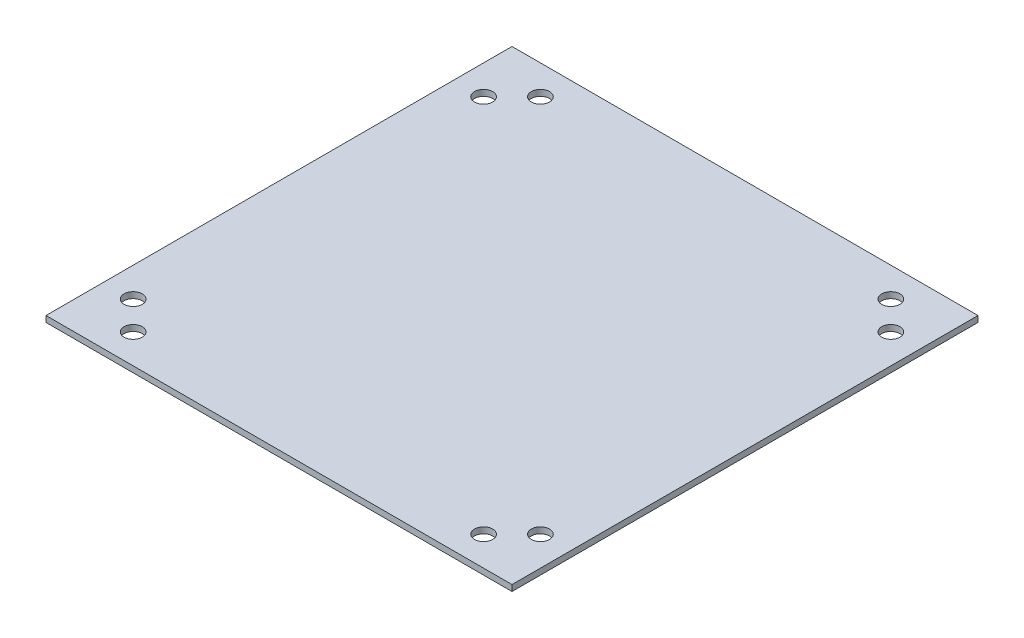
ISO-10303-21;
HEADER;
FILE_DESCRIPTION(('STEP AP214'),'2;1');
FILE_NAME('part.step','',(''),(''),'','','');
FILE_SCHEMA(('AUTOMOTIVE_DESIGN { 1 0 10303 214 1 1 1 1 }'));
ENDSEC;
DATA;
#1=APPLICATION_CONTEXT('core data for automotive mechanical design processes');
#2=APPLICATION_PROTOCOL_DEFINITION('international standard','automotive_design',2000,#1);
#3=PRODUCT_CONTEXT('',#1,'mechanical');
#4=PRODUCT('Part','Part','',(#3));
#5=PRODUCT_RELATED_PRODUCT_CATEGORY('part','',(#4));
#6=PRODUCT_DEFINITION_FORMATION('','',#4);
#7=PRODUCT_DEFINITION_CONTEXT('part definition',#1,'design');
#8=PRODUCT_DEFINITION('design','',#6,#7);
#9=PRODUCT_DEFINITION_SHAPE('','',#8);
#10=(LENGTH_UNIT() NAMED_UNIT(*) SI_UNIT(.MILLI.,.METRE.));
#11=(NAMED_UNIT(*) PLANE_ANGLE_UNIT() SI_UNIT($,.RADIAN.));
#12=(NAMED_UNIT(*) SI_UNIT($,.STERADIAN.) SOLID_ANGLE_UNIT());
#13=UNCERTAINTY_MEASURE_WITH_UNIT(LENGTH_MEASURE(1.E-05),#10,'distance_accuracy_value','');
#14=(GEOMETRIC_REPRESENTATION_CONTEXT(3) GLOBAL_UNCERTAINTY_ASSIGNED_CONTEXT((#13)) GLOBAL_UNIT_ASSIGNED_CONTEXT((#10,
#11,#12)) REPRESENTATION_CONTEXT('',''));
#15=CARTESIAN_POINT('',(0.,0.,0.));
#16=DIRECTION('',(0.,0.,1.));
#17=DIRECTION('',(1.,0.,0.));
#18=AXIS2_PLACEMENT_3D('',#15,#16,#17);
#19=CARTESIAN_POINT('',(-1.3,0.,-98.7));
#20=DIRECTION('',(-1.,0.,0.));
#21=DIRECTION('',(0.,0.,1.));
#22=AXIS2_PLACEMENT_3D('',#19,#20,#21);
#23=PLANE('',#22);
#24=DIRECTION('',(0.,0.,1.));
#25=VECTOR('',#24,1.);
#26=CARTESIAN_POINT('',(-1.3,1.3,-98.7));
#27=LINE('',#26,#25);
#28=CARTESIAN_POINT('',(-1.3,1.3,-98.7));
#29=VERTEX_POINT('',#28);
#30=CARTESIAN_POINT('',(-1.29999999999999,1.3,1.3));
#31=VERTEX_POINT('',#30);
#32=EDGE_CURVE('E101',#29,#31,#27,.T.);
#33=ORIENTED_EDGE('',*,*,#32,.F.);
#34=DIRECTION('',(0.,1.,0.));
#35=VECTOR('',#34,1.);
#36=CARTESIAN_POINT('',(-1.3,0.,-98.7));
#37=LINE('',#36,#35);
#38=CARTESIAN_POINT('',(-1.3,0.,-98.7));
#39=VERTEX_POINT('',#38);
#40=EDGE_CURVE('E11',#39,#29,#37,.T.);
#41=ORIENTED_EDGE('',*,*,#40,.F.);
#42=DIRECTION('',(0.,0.,1.));
#43=VECTOR('',#42,1.);
#44=CARTESIAN_POINT('',(-1.3,0.,-98.7));
#45=LINE('',#44,#43);
#46=CARTESIAN_POINT('',(-1.29999999999999,0.,1.3));
#47=VERTEX_POINT('',#46);
#48=EDGE_CURVE('E95',#39,#47,#45,.T.);
#49=ORIENTED_EDGE('',*,*,#48,.T.);
#50=DIRECTION('',(0.,1.,0.));
#51=VECTOR('',#50,1.);
#52=CARTESIAN_POINT('',(-1.29999999999999,0.,1.3));
#53=LINE('',#52,#51);
#54=EDGE_CURVE('E39',#47,#31,#53,.T.);
#55=ORIENTED_EDGE('',*,*,#54,.T.);
#56=EDGE_LOOP('',(#33,#41,#49,#55));
#57=FACE_BOUND('',#56,.T.);
#58=ADVANCED_FACE('F35',(#57),#23,.T.);
#59=CARTESIAN_POINT('',(-1.3,0.,-98.7));
#60=DIRECTION('',(0.,0.,1.));
#61=DIRECTION('',(1.,0.,0.));
#62=AXIS2_PLACEMENT_3D('',#59,#60,#61);
#63=PLANE('',#62);
#64=DIRECTION('',(1.,0.,0.));
#65=VECTOR('',#64,1.);
#66=CARTESIAN_POINT('',(-1.3,1.3,-98.7));
#67=LINE('',#66,#65);
#68=CARTESIAN_POINT('',(98.7,1.3,-98.7));
#69=VERTEX_POINT('',#68);
#70=EDGE_CURVE('E69',#29,#69,#67,.T.);
#71=ORIENTED_EDGE('',*,*,#70,.T.);
#72=DIRECTION('',(0.,1.,0.));
#73=VECTOR('',#72,1.);
#74=CARTESIAN_POINT('',(98.7,0.,-98.7));
#75=LINE('',#74,#73);
#76=CARTESIAN_POINT('',(98.7,0.,-98.7));
#77=VERTEX_POINT('',#76);
#78=EDGE_CURVE('E45',#77,#69,#75,.T.);
#79=ORIENTED_EDGE('',*,*,#78,.F.);
#80=DIRECTION('',(1.,0.,0.));
#81=VECTOR('',#80,1.);
#82=CARTESIAN_POINT('',(-1.3,0.,-98.7));
#83=LINE('',#82,#81);
#84=EDGE_CURVE('E85',#39,#77,#83,.T.);
#85=ORIENTED_EDGE('',*,*,#84,.F.);
#86=ORIENTED_EDGE('',*,*,#40,.T.);
#87=EDGE_LOOP('',(#71,#79,#85,#86));
#88=FACE_BOUND('',#87,.T.);
#89=ADVANCED_FACE('F112',(#88),#63,.F.);
#90=CARTESIAN_POINT('',(98.7,0.,-98.7));
#91=DIRECTION('',(-1.,0.,0.));
#92=DIRECTION('',(0.,0.,1.));
#93=AXIS2_PLACEMENT_3D('',#90,#91,#92);
#94=PLANE('',#93);
#95=DIRECTION('',(0.,0.,1.));
#96=VECTOR('',#95,1.);
#97=CARTESIAN_POINT('',(98.7,1.3,-98.7));
#98=LINE('',#97,#96);
#99=CARTESIAN_POINT('',(98.7,1.3,1.3));
#100=VERTEX_POINT('',#99);
#101=EDGE_CURVE('E92',#69,#100,#98,.T.);
#102=ORIENTED_EDGE('',*,*,#101,.T.);
#103=DIRECTION('',(0.,1.,0.));
#104=VECTOR('',#103,1.);
#105=CARTESIAN_POINT('',(98.7,0.,1.3));
#106=LINE('',#105,#104);
#107=CARTESIAN_POINT('',(98.7,0.,1.3));
#108=VERTEX_POINT('',#107);
#109=EDGE_CURVE('E89',#108,#100,#106,.T.);
#110=ORIENTED_EDGE('',*,*,#109,.F.);
#111=DIRECTION('',(0.,0.,1.));
#112=VECTOR('',#111,1.);
#113=CARTESIAN_POINT('',(98.7,0.,-98.7));
#114=LINE('',#113,#112);
#115=EDGE_CURVE('E81',#77,#108,#114,.T.);
#116=ORIENTED_EDGE('',*,*,#115,.F.);
#117=ORIENTED_EDGE('',*,*,#78,.T.);
#118=EDGE_LOOP('',(#102,#110,#116,#117));
#119=FACE_BOUND('',#118,.T.);
#120=ADVANCED_FACE('F90',(#119),#94,.F.);
#121=CARTESIAN_POINT('',(-1.29999999999999,0.,1.3));
#122=DIRECTION('',(0.,0.,1.));
#123=DIRECTION('',(1.,0.,0.));
#124=AXIS2_PLACEMENT_3D('',#121,#122,#123);
#125=PLANE('',#124);
#126=DIRECTION('',(1.,0.,0.));
#127=VECTOR('',#126,1.);
#128=CARTESIAN_POINT('',(-1.29999999999999,1.3,1.3));
#129=LINE('',#128,#127);
#130=EDGE_CURVE('E104',#31,#100,#129,.T.);
#131=ORIENTED_EDGE('',*,*,#130,.F.);
#132=ORIENTED_EDGE('',*,*,#54,.F.);
#133=DIRECTION('',(1.,0.,0.));
#134=VECTOR('',#133,1.);
#135=CARTESIAN_POINT('',(-1.29999999999999,0.,1.3));
#136=LINE('',#135,#134);
#137=EDGE_CURVE('E84',#47,#108,#136,.T.);
#138=ORIENTED_EDGE('',*,*,#137,.T.);
#139=ORIENTED_EDGE('',*,*,#109,.T.);
#140=EDGE_LOOP('',(#131,#132,#138,#139));
#141=FACE_BOUND('',#140,.T.);
#142=ADVANCED_FACE('F94',(#141),#125,.T.);
#143=CARTESIAN_POINT('',(0.,1.3,0.));
#144=DIRECTION('',(0.,1.,0.));
#145=DIRECTION('',(0.,0.,1.));
#146=AXIS2_PLACEMENT_3D('',#143,#144,#145);
#147=PLANE('',#146);
#148=CARTESIAN_POINT('',(92.4,1.3,-11.1));
#149=DIRECTION('',(0.,-1.,0.));
#150=DIRECTION('',(0.,0.,-1.));
#151=AXIS2_PLACEMENT_3D('',#148,#149,#150);
#152=CIRCLE('',#151,1.95);
#153=CARTESIAN_POINT('',(92.4,1.3,-13.05));
#154=VERTEX_POINT('',#153);
#155=EDGE_CURVE('E131',#154,#154,#152,.T.);
#156=ORIENTED_EDGE('',*,*,#155,.T.);
#157=EDGE_LOOP('',(#156));
#158=FACE_BOUND('',#157,.T.);
#159=CARTESIAN_POINT('',(86.3,1.3,-5.));
#160=DIRECTION('',(0.,-1.,0.));
#161=DIRECTION('',(0.,0.,-1.));
#162=AXIS2_PLACEMENT_3D('',#159,#160,#161);
#163=CIRCLE('',#162,1.95);
#164=CARTESIAN_POINT('',(86.3,1.3,-6.95));
#165=VERTEX_POINT('',#164);
#166=EDGE_CURVE('E135',#165,#165,#163,.T.);
#167=ORIENTED_EDGE('',*,*,#166,.T.);
#168=EDGE_LOOP('',(#167));
#169=FACE_BOUND('',#168,.T.);
#170=CARTESIAN_POINT('',(11.1,1.3,-5.));
#171=DIRECTION('',(0.,-1.,0.));
#172=DIRECTION('',(0.,0.,-1.));
#173=AXIS2_PLACEMENT_3D('',#170,#171,#172);
#174=CIRCLE('',#173,1.95);
#175=CARTESIAN_POINT('',(11.1,1.3,-6.95));
#176=VERTEX_POINT('',#175);
#177=EDGE_CURVE('E139',#176,#176,#174,.T.);
#178=ORIENTED_EDGE('',*,*,#177,.T.);
#179=EDGE_LOOP('',(#178));
#180=FACE_BOUND('',#179,.T.);
#181=CARTESIAN_POINT('',(5.,1.3,-11.1));
#182=DIRECTION('',(0.,-1.,0.));
#183=DIRECTION('',(0.,0.,-1.));
#184=AXIS2_PLACEMENT_3D('',#181,#182,#183);
#185=CIRCLE('',#184,1.95);
#186=CARTESIAN_POINT('',(5.,1.3,-13.05));
#187=VERTEX_POINT('',#186);
#188=EDGE_CURVE('E143',#187,#187,#185,.T.);
#189=ORIENTED_EDGE('',*,*,#188,.T.);
#190=EDGE_LOOP('',(#189));
#191=FACE_BOUND('',#190,.T.);
#192=CARTESIAN_POINT('',(5.,1.3,-86.3));
#193=DIRECTION('',(0.,-1.,0.));
#194=DIRECTION('',(0.,0.,-1.));
#195=AXIS2_PLACEMENT_3D('',#192,#193,#194);
#196=CIRCLE('',#195,1.95000000000001);
#197=CARTESIAN_POINT('',(5.,1.3,-88.25));
#198=VERTEX_POINT('',#197);
#199=EDGE_CURVE('E147',#198,#198,#196,.T.);
#200=ORIENTED_EDGE('',*,*,#199,.T.);
#201=EDGE_LOOP('',(#200));
#202=FACE_BOUND('',#201,.T.);
#203=CARTESIAN_POINT('',(11.1,1.3,-92.4));
#204=DIRECTION('',(0.,-1.,0.));
#205=DIRECTION('',(0.,0.,-1.));
#206=AXIS2_PLACEMENT_3D('',#203,#204,#205);
#207=CIRCLE('',#206,1.94999999999999);
#208=CARTESIAN_POINT('',(11.1,1.3,-94.35));
#209=VERTEX_POINT('',#208);
#210=EDGE_CURVE('E151',#209,#209,#207,.T.);
#211=ORIENTED_EDGE('',*,*,#210,.T.);
#212=EDGE_LOOP('',(#211));
#213=FACE_BOUND('',#212,.T.);
#214=CARTESIAN_POINT('',(86.3,1.3,-92.4));
#215=DIRECTION('',(0.,-1.,0.));
#216=DIRECTION('',(0.,0.,-1.));
#217=AXIS2_PLACEMENT_3D('',#214,#215,#216);
#218=CIRCLE('',#217,1.95);
#219=CARTESIAN_POINT('',(86.3,1.3,-94.35));
#220=VERTEX_POINT('',#219);
#221=EDGE_CURVE('E155',#220,#220,#218,.T.);
#222=ORIENTED_EDGE('',*,*,#221,.T.);
#223=EDGE_LOOP('',(#222));
#224=FACE_BOUND('',#223,.T.);
#225=CARTESIAN_POINT('',(92.4,1.3,-86.3));
#226=DIRECTION('',(0.,-1.,0.));
#227=DIRECTION('',(0.,0.,-1.));
#228=AXIS2_PLACEMENT_3D('',#225,#226,#227);
#229=CIRCLE('',#228,1.95);
#230=CARTESIAN_POINT('',(92.4,1.3,-88.25));
#231=VERTEX_POINT('',#230);
#232=EDGE_CURVE('E105',#231,#231,#229,.T.);
#233=ORIENTED_EDGE('',*,*,#232,.T.);
#234=EDGE_LOOP('',(#233));
#235=FACE_BOUND('',#234,.T.);
#236=ORIENTED_EDGE('',*,*,#32,.T.);
#237=ORIENTED_EDGE('',*,*,#130,.T.);
#238=ORIENTED_EDGE('',*,*,#101,.F.);
#239=ORIENTED_EDGE('',*,*,#70,.F.);
#240=EDGE_LOOP('',(#236,#237,#238,#239));
#241=FACE_BOUND('',#240,.T.);
#242=ADVANCED_FACE('F110',(#158,#169,#180,#191,#202,#213,#224,#235,#241),#147,.T.);
#243=CARTESIAN_POINT('',(0.,0.,0.));
#244=DIRECTION('',(0.,1.,0.));
#245=DIRECTION('',(0.,0.,1.));
#246=AXIS2_PLACEMENT_3D('',#243,#244,#245);
#247=PLANE('',#246);
#248=CARTESIAN_POINT('',(92.4,0.,-11.1));
#249=DIRECTION('',(0.,-1.,0.));
#250=DIRECTION('',(0.,0.,-1.));
#251=AXIS2_PLACEMENT_3D('',#248,#249,#250);
#252=CIRCLE('',#251,1.95);
#253=CARTESIAN_POINT('',(92.4,0.,-13.05));
#254=VERTEX_POINT('',#253);
#255=EDGE_CURVE('E187',#254,#254,#252,.T.);
#256=ORIENTED_EDGE('',*,*,#255,.F.);
#257=EDGE_LOOP('',(#256));
#258=FACE_BOUND('',#257,.T.);
#259=CARTESIAN_POINT('',(86.3,0.,-5.));
#260=DIRECTION('',(0.,-1.,0.));
#261=DIRECTION('',(0.,0.,-1.));
#262=AXIS2_PLACEMENT_3D('',#259,#260,#261);
#263=CIRCLE('',#262,1.95);
#264=CARTESIAN_POINT('',(86.3,0.,-6.95));
#265=VERTEX_POINT('',#264);
#266=EDGE_CURVE('E183',#265,#265,#263,.T.);
#267=ORIENTED_EDGE('',*,*,#266,.F.);
#268=EDGE_LOOP('',(#267));
#269=FACE_BOUND('',#268,.T.);
#270=CARTESIAN_POINT('',(11.1,0.,-5.));
#271=DIRECTION('',(0.,-1.,0.));
#272=DIRECTION('',(0.,0.,-1.));
#273=AXIS2_PLACEMENT_3D('',#270,#271,#272);
#274=CIRCLE('',#273,1.95);
#275=CARTESIAN_POINT('',(11.1,0.,-6.95));
#276=VERTEX_POINT('',#275);
#277=EDGE_CURVE('E179',#276,#276,#274,.T.);
#278=ORIENTED_EDGE('',*,*,#277,.F.);
#279=EDGE_LOOP('',(#278));
#280=FACE_BOUND('',#279,.T.);
#281=CARTESIAN_POINT('',(5.,0.,-11.1));
#282=DIRECTION('',(0.,-1.,0.));
#283=DIRECTION('',(0.,0.,-1.));
#284=AXIS2_PLACEMENT_3D('',#281,#282,#283);
#285=CIRCLE('',#284,1.95);
#286=CARTESIAN_POINT('',(5.,0.,-13.05));
#287=VERTEX_POINT('',#286);
#288=EDGE_CURVE('E175',#287,#287,#285,.T.);
#289=ORIENTED_EDGE('',*,*,#288,.F.);
#290=EDGE_LOOP('',(#289));
#291=FACE_BOUND('',#290,.T.);
#292=CARTESIAN_POINT('',(5.,0.,-86.3));
#293=DIRECTION('',(0.,-1.,0.));
#294=DIRECTION('',(0.,0.,-1.));
#295=AXIS2_PLACEMENT_3D('',#292,#293,#294);
#296=CIRCLE('',#295,1.95000000000001);
#297=CARTESIAN_POINT('',(5.,0.,-88.25));
#298=VERTEX_POINT('',#297);
#299=EDGE_CURVE('E171',#298,#298,#296,.T.);
#300=ORIENTED_EDGE('',*,*,#299,.F.);
#301=EDGE_LOOP('',(#300));
#302=FACE_BOUND('',#301,.T.);
#303=CARTESIAN_POINT('',(11.1,0.,-92.4));
#304=DIRECTION('',(0.,-1.,0.));
#305=DIRECTION('',(0.,0.,-1.));
#306=AXIS2_PLACEMENT_3D('',#303,#304,#305);
#307=CIRCLE('',#306,1.94999999999999);
#308=CARTESIAN_POINT('',(11.1,0.,-94.35));
#309=VERTEX_POINT('',#308);
#310=EDGE_CURVE('E167',#309,#309,#307,.T.);
#311=ORIENTED_EDGE('',*,*,#310,.F.);
#312=EDGE_LOOP('',(#311));
#313=FACE_BOUND('',#312,.T.);
#314=CARTESIAN_POINT('',(86.3,0.,-92.4));
#315=DIRECTION('',(0.,-1.,0.));
#316=DIRECTION('',(0.,0.,-1.));
#317=AXIS2_PLACEMENT_3D('',#314,#315,#316);
#318=CIRCLE('',#317,1.95);
#319=CARTESIAN_POINT('',(86.3,0.,-94.35));
#320=VERTEX_POINT('',#319);
#321=EDGE_CURVE('E163',#320,#320,#318,.T.);
#322=ORIENTED_EDGE('',*,*,#321,.F.);
#323=EDGE_LOOP('',(#322));
#324=FACE_BOUND('',#323,.T.);
#325=CARTESIAN_POINT('',(92.4,0.,-86.3));
#326=DIRECTION('',(0.,-1.,0.));
#327=DIRECTION('',(0.,0.,-1.));
#328=AXIS2_PLACEMENT_3D('',#325,#326,#327);
#329=CIRCLE('',#328,1.95);
#330=CARTESIAN_POINT('',(92.4,0.,-88.25));
#331=VERTEX_POINT('',#330);
#332=EDGE_CURVE('E159',#331,#331,#329,.T.);
#333=ORIENTED_EDGE('',*,*,#332,.F.);
#334=EDGE_LOOP('',(#333));
#335=FACE_BOUND('',#334,.T.);
#336=ORIENTED_EDGE('',*,*,#48,.F.);
#337=ORIENTED_EDGE('',*,*,#84,.T.);
#338=ORIENTED_EDGE('',*,*,#115,.T.);
#339=ORIENTED_EDGE('',*,*,#137,.F.);
#340=EDGE_LOOP('',(#336,#337,#338,#339));
#341=FACE_BOUND('',#340,.T.);
#342=ADVANCED_FACE('F37',(#258,#269,#280,#291,#302,#313,#324,#335,#341),#247,.F.);
#343=CARTESIAN_POINT('',(92.4,1.3,-86.3));
#344=DIRECTION('',(0.,-1.,0.));
#345=DIRECTION('',(0.,0.,-1.));
#346=AXIS2_PLACEMENT_3D('',#343,#344,#345);
#347=CYLINDRICAL_SURFACE('',#346,1.95);
#348=ORIENTED_EDGE('',*,*,#232,.F.);
#349=EDGE_LOOP('',(#348));
#350=FACE_BOUND('',#349,.T.);
#351=ORIENTED_EDGE('',*,*,#332,.T.);
#352=EDGE_LOOP('',(#351));
#353=FACE_BOUND('',#352,.T.);
#354=ADVANCED_FACE('F126',(#350,#353),#347,.F.);
#355=CARTESIAN_POINT('',(86.3,1.3,-92.4));
#356=DIRECTION('',(0.,-1.,0.));
#357=DIRECTION('',(0.,0.,-1.));
#358=AXIS2_PLACEMENT_3D('',#355,#356,#357);
#359=CYLINDRICAL_SURFACE('',#358,1.95);
#360=ORIENTED_EDGE('',*,*,#221,.F.);
#361=EDGE_LOOP('',(#360));
#362=FACE_BOUND('',#361,.T.);
#363=ORIENTED_EDGE('',*,*,#321,.T.);
#364=EDGE_LOOP('',(#363));
#365=FACE_BOUND('',#364,.T.);
#366=ADVANCED_FACE('F209',(#362,#365),#359,.F.);
#367=CARTESIAN_POINT('',(11.1,1.3,-92.4));
#368=DIRECTION('',(0.,-1.,0.));
#369=DIRECTION('',(0.,0.,-1.));
#370=AXIS2_PLACEMENT_3D('',#367,#368,#369);
#371=CYLINDRICAL_SURFACE('',#370,1.94999999999999);
#372=ORIENTED_EDGE('',*,*,#210,.F.);
#373=EDGE_LOOP('',(#372));
#374=FACE_BOUND('',#373,.T.);
#375=ORIENTED_EDGE('',*,*,#310,.T.);
#376=EDGE_LOOP('',(#375));
#377=FACE_BOUND('',#376,.T.);
#378=ADVANCED_FACE('F214',(#374,#377),#371,.F.);
#379=CARTESIAN_POINT('',(5.,1.3,-86.3));
#380=DIRECTION('',(0.,-1.,0.));
#381=DIRECTION('',(0.,0.,-1.));
#382=AXIS2_PLACEMENT_3D('',#379,#380,#381);
#383=CYLINDRICAL_SURFACE('',#382,1.95000000000001);
#384=ORIENTED_EDGE('',*,*,#199,.F.);
#385=EDGE_LOOP('',(#384));
#386=FACE_BOUND('',#385,.T.);
#387=ORIENTED_EDGE('',*,*,#299,.T.);
#388=EDGE_LOOP('',(#387));
#389=FACE_BOUND('',#388,.T.);
#390=ADVANCED_FACE('F258',(#386,#389),#383,.F.);
#391=CARTESIAN_POINT('',(5.,1.3,-11.1));
#392=DIRECTION('',(0.,-1.,0.));
#393=DIRECTION('',(0.,0.,-1.));
#394=AXIS2_PLACEMENT_3D('',#391,#392,#393);
#395=CYLINDRICAL_SURFACE('',#394,1.95);
#396=ORIENTED_EDGE('',*,*,#188,.F.);
#397=EDGE_LOOP('',(#396));
#398=FACE_BOUND('',#397,.T.);
#399=ORIENTED_EDGE('',*,*,#288,.T.);
#400=EDGE_LOOP('',(#399));
#401=FACE_BOUND('',#400,.T.);
#402=ADVANCED_FACE('F267',(#398,#401),#395,.F.);
#403=CARTESIAN_POINT('',(11.1,1.3,-5.));
#404=DIRECTION('',(0.,-1.,0.));
#405=DIRECTION('',(0.,0.,-1.));
#406=AXIS2_PLACEMENT_3D('',#403,#404,#405);
#407=CYLINDRICAL_SURFACE('',#406,1.95);
#408=ORIENTED_EDGE('',*,*,#177,.F.);
#409=EDGE_LOOP('',(#408));
#410=FACE_BOUND('',#409,.T.);
#411=ORIENTED_EDGE('',*,*,#277,.T.);
#412=EDGE_LOOP('',(#411));
#413=FACE_BOUND('',#412,.T.);
#414=ADVANCED_FACE('F277',(#410,#413),#407,.F.);
#415=CARTESIAN_POINT('',(86.3,1.3,-5.));
#416=DIRECTION('',(0.,-1.,0.));
#417=DIRECTION('',(0.,0.,-1.));
#418=AXIS2_PLACEMENT_3D('',#415,#416,#417);
#419=CYLINDRICAL_SURFACE('',#418,1.95);
#420=ORIENTED_EDGE('',*,*,#166,.F.);
#421=EDGE_LOOP('',(#420));
#422=FACE_BOUND('',#421,.T.);
#423=ORIENTED_EDGE('',*,*,#266,.T.);
#424=EDGE_LOOP('',(#423));
#425=FACE_BOUND('',#424,.T.);
#426=ADVANCED_FACE('F287',(#422,#425),#419,.F.);
#427=CARTESIAN_POINT('',(92.4,1.3,-11.1));
#428=DIRECTION('',(0.,-1.,0.));
#429=DIRECTION('',(0.,0.,-1.));
#430=AXIS2_PLACEMENT_3D('',#427,#428,#429);
#431=CYLINDRICAL_SURFACE('',#430,1.95);
#432=ORIENTED_EDGE('',*,*,#155,.F.);
#433=EDGE_LOOP('',(#432));
#434=FACE_BOUND('',#433,.T.);
#435=ORIENTED_EDGE('',*,*,#255,.T.);
#436=EDGE_LOOP('',(#435));
#437=FACE_BOUND('',#436,.T.);
#438=ADVANCED_FACE('F192',(#434,#437),#431,.F.);
#439=CLOSED_SHELL('',(#58,#89,#120,#142,#242,#342,#354,#366,#378,#390,#402,#414,#426,#438));
#440=MANIFOLD_SOLID_BREP('B2',#439);
#441=ADVANCED_BREP_SHAPE_REPRESENTATION('',(#18,#440),#14);
#442=SHAPE_DEFINITION_REPRESENTATION(#9,#441);
ENDSEC;
END-ISO-10303-21;
